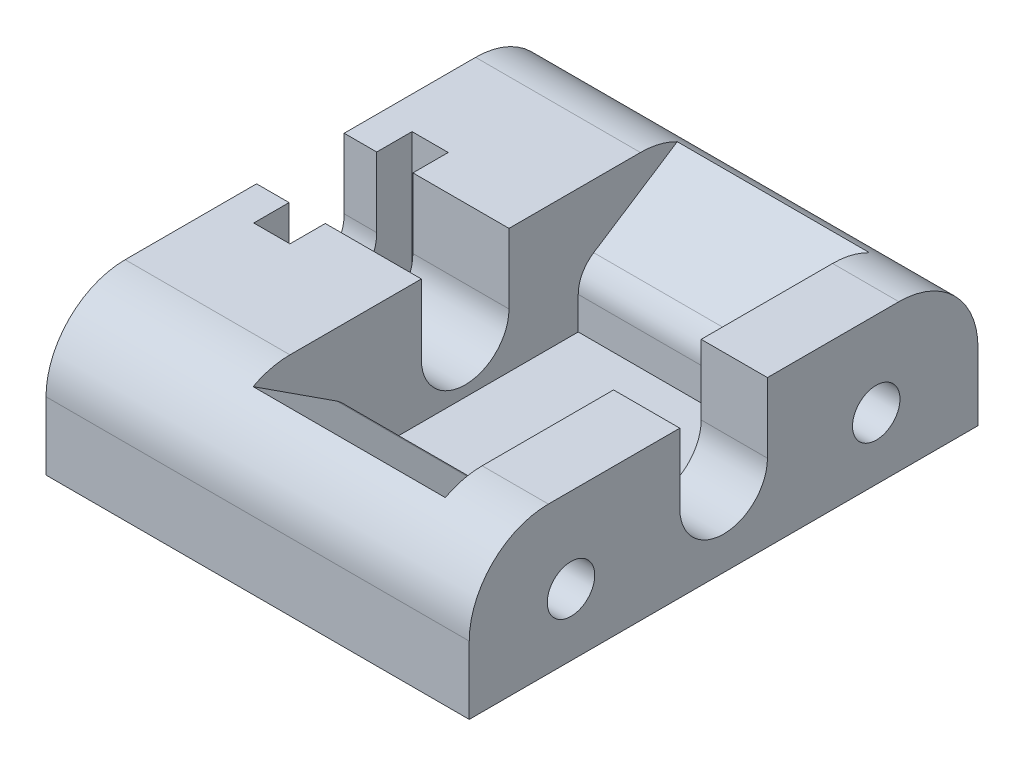
ISO-10303-21;
HEADER;
FILE_DESCRIPTION(('STEP AP214'),'2;1');
FILE_NAME('part.step','',(''),(''),'','','');
FILE_SCHEMA(('AUTOMOTIVE_DESIGN { 1 0 10303 214 1 1 1 1 }'));
ENDSEC;
DATA;
#1=APPLICATION_CONTEXT('core data for automotive mechanical design processes');
#2=APPLICATION_PROTOCOL_DEFINITION('international standard','automotive_design',2000,#1);
#3=PRODUCT_CONTEXT('',#1,'mechanical');
#4=PRODUCT('Part','Part','',(#3));
#5=PRODUCT_RELATED_PRODUCT_CATEGORY('part','',(#4));
#6=PRODUCT_DEFINITION_FORMATION('','',#4);
#7=PRODUCT_DEFINITION_CONTEXT('part definition',#1,'design');
#8=PRODUCT_DEFINITION('design','',#6,#7);
#9=PRODUCT_DEFINITION_SHAPE('','',#8);
#10=(LENGTH_UNIT() NAMED_UNIT(*) SI_UNIT(.MILLI.,.METRE.));
#11=(NAMED_UNIT(*) PLANE_ANGLE_UNIT() SI_UNIT($,.RADIAN.));
#12=(NAMED_UNIT(*) SI_UNIT($,.STERADIAN.) SOLID_ANGLE_UNIT());
#13=UNCERTAINTY_MEASURE_WITH_UNIT(LENGTH_MEASURE(1.E-05),#10,'distance_accuracy_value','');
#14=(GEOMETRIC_REPRESENTATION_CONTEXT(3) GLOBAL_UNCERTAINTY_ASSIGNED_CONTEXT((#13)) GLOBAL_UNIT_ASSIGNED_CONTEXT((#10,
#11,#12)) REPRESENTATION_CONTEXT('',''));
#15=CARTESIAN_POINT('',(0.,0.,0.));
#16=DIRECTION('',(0.,0.,1.));
#17=DIRECTION('',(1.,0.,0.));
#18=AXIS2_PLACEMENT_3D('',#15,#16,#17);
#19=CARTESIAN_POINT('',(0.,42.,-45.));
#20=DIRECTION('',(0.,0.,1.));
#21=DIRECTION('',(1.,0.,0.));
#22=AXIS2_PLACEMENT_3D('',#19,#20,#21);
#23=PLANE('',#22);
#24=DIRECTION('',(1.,0.,0.));
#25=VECTOR('',#24,1.);
#26=CARTESIAN_POINT('',(0.,29.,-45.));
#27=LINE('',#26,#25);
#28=CARTESIAN_POINT('',(129.123144903408,29.,-45.));
#29=VERTEX_POINT('',#28);
#30=CARTESIAN_POINT('',(166.559737407802,29.,-45.));
#31=VERTEX_POINT('',#30);
#32=EDGE_CURVE('E58',#29,#31,#27,.T.);
#33=ORIENTED_EDGE('',*,*,#32,.F.);
#34=DIRECTION('',(0.,1.,0.));
#35=VECTOR('',#34,1.);
#36=CARTESIAN_POINT('',(129.123144903408,42.,-45.));
#37=LINE('',#36,#35);
#38=CARTESIAN_POINT('',(129.123144903408,35.,-45.));
#39=VERTEX_POINT('',#38);
#40=EDGE_CURVE('E598',#29,#39,#37,.T.);
#41=ORIENTED_EDGE('',*,*,#40,.T.);
#42=DIRECTION('',(-1.,0.,0.));
#43=VECTOR('',#42,1.);
#44=CARTESIAN_POINT('',(0.,35.,-45.));
#45=LINE('',#44,#43);
#46=CARTESIAN_POINT('',(166.559737407802,35.,-45.));
#47=VERTEX_POINT('',#46);
#48=EDGE_CURVE('E468',#39,#47,#45,.F.);
#49=ORIENTED_EDGE('',*,*,#48,.T.);
#50=DIRECTION('',(0.,-1.,0.));
#51=VECTOR('',#50,1.);
#52=CARTESIAN_POINT('',(166.559737407802,42.,-45.));
#53=LINE('',#52,#51);
#54=EDGE_CURVE('E65',#47,#31,#53,.T.);
#55=ORIENTED_EDGE('',*,*,#54,.T.);
#56=EDGE_LOOP('',(#33,#41,#49,#55));
#57=FACE_BOUND('',#56,.T.);
#58=ADVANCED_FACE('F43',(#57),#23,.F.);
#59=CARTESIAN_POINT('',(0.,42.,0.));
#60=DIRECTION('',(0.,0.,-1.));
#61=DIRECTION('',(-1.,0.,0.));
#62=AXIS2_PLACEMENT_3D('',#59,#60,#61);
#63=PLANE('',#62);
#64=DIRECTION('',(-1.,0.,0.));
#65=VECTOR('',#64,1.);
#66=CARTESIAN_POINT('',(0.,29.,0.));
#67=LINE('',#66,#65);
#68=CARTESIAN_POINT('',(166.559737407802,29.,0.));
#69=VERTEX_POINT('',#68);
#70=CARTESIAN_POINT('',(129.123144903408,29.,0.));
#71=VERTEX_POINT('',#70);
#72=EDGE_CURVE('E251',#69,#71,#67,.T.);
#73=ORIENTED_EDGE('',*,*,#72,.F.);
#74=DIRECTION('',(0.,1.,0.));
#75=VECTOR('',#74,1.);
#76=CARTESIAN_POINT('',(166.559737407802,42.,0.));
#77=LINE('',#76,#75);
#78=CARTESIAN_POINT('',(166.559737407802,35.,0.));
#79=VERTEX_POINT('',#78);
#80=EDGE_CURVE('E258',#69,#79,#77,.T.);
#81=ORIENTED_EDGE('',*,*,#80,.T.);
#82=DIRECTION('',(1.,0.,0.));
#83=VECTOR('',#82,1.);
#84=CARTESIAN_POINT('',(0.,35.,0.));
#85=LINE('',#84,#83);
#86=CARTESIAN_POINT('',(129.123144903408,35.,0.));
#87=VERTEX_POINT('',#86);
#88=EDGE_CURVE('E472',#79,#87,#85,.F.);
#89=ORIENTED_EDGE('',*,*,#88,.T.);
#90=DIRECTION('',(0.,-1.,0.));
#91=VECTOR('',#90,1.);
#92=CARTESIAN_POINT('',(129.123144903408,42.,0.));
#93=LINE('',#92,#91);
#94=EDGE_CURVE('E260',#87,#71,#93,.T.);
#95=ORIENTED_EDGE('',*,*,#94,.T.);
#96=EDGE_LOOP('',(#73,#81,#89,#95));
#97=FACE_BOUND('',#96,.T.);
#98=ADVANCED_FACE('F256',(#97),#63,.F.);
#99=CARTESIAN_POINT('',(129.123144903408,-5.,-62.8352263072276));
#100=DIRECTION('',(1.,0.,0.));
#101=DIRECTION('',(0.,0.,-1.));
#102=AXIS2_PLACEMENT_3D('',#99,#100,#101);
#103=PLANE('',#102);
#104=CARTESIAN_POINT('',(129.123144903408,34.5,-9.));
#105=DIRECTION('',(1.,0.,0.));
#106=DIRECTION('',(0.,0.,-1.));
#107=AXIS2_PLACEMENT_3D('',#104,#105,#106);
#108=CIRCLE('',#107,2.65);
#109=CARTESIAN_POINT('',(129.123144903408,34.5,-11.65));
#110=VERTEX_POINT('',#109);
#111=EDGE_CURVE('E611',#110,#110,#108,.F.);
#112=ORIENTED_EDGE('',*,*,#111,.F.);
#113=EDGE_LOOP('',(#112));
#114=FACE_BOUND('',#113,.T.);
#115=CARTESIAN_POINT('',(129.123144903408,34.5,-36.));
#116=DIRECTION('',(1.,0.,0.));
#117=DIRECTION('',(0.,0.,-1.));
#118=AXIS2_PLACEMENT_3D('',#115,#116,#117);
#119=CIRCLE('',#118,2.65);
#120=CARTESIAN_POINT('',(129.123144903408,34.5,-38.65));
#121=VERTEX_POINT('',#120);
#122=EDGE_CURVE('E603',#121,#121,#119,.F.);
#123=ORIENTED_EDGE('',*,*,#122,.F.);
#124=EDGE_LOOP('',(#123));
#125=FACE_BOUND('',#124,.T.);
#126=DIRECTION('',(0.,0.,-1.));
#127=VECTOR('',#126,1.);
#128=CARTESIAN_POINT('',(129.123144903408,29.,-62.8352263072276));
#129=LINE('',#128,#127);
#130=EDGE_CURVE('E760',#71,#29,#129,.T.);
#131=ORIENTED_EDGE('',*,*,#130,.F.);
#132=ORIENTED_EDGE('',*,*,#94,.F.);
#133=CARTESIAN_POINT('',(129.123144903408,35.,-7.));
#134=DIRECTION('',(1.,0.,0.));
#135=DIRECTION('',(0.,0.,-1.));
#136=AXIS2_PLACEMENT_3D('',#133,#134,#135);
#137=CIRCLE('',#136,7.);
#138=CARTESIAN_POINT('',(129.123144903408,42.,-7.));
#139=VERTEX_POINT('',#138);
#140=EDGE_CURVE('E599',#87,#139,#137,.F.);
#141=ORIENTED_EDGE('',*,*,#140,.T.);
#142=DIRECTION('',(0.,0.,-1.));
#143=VECTOR('',#142,1.);
#144=CARTESIAN_POINT('',(129.123144903408,42.,-62.8352263072276));
#145=LINE('',#144,#143);
#146=CARTESIAN_POINT('',(129.123144903408,42.,-18.625));
#147=VERTEX_POINT('',#146);
#148=EDGE_CURVE('E765',#139,#147,#145,.T.);
#149=ORIENTED_EDGE('',*,*,#148,.T.);
#150=DIRECTION('',(0.,1.,0.));
#151=VECTOR('',#150,1.);
#152=CARTESIAN_POINT('',(129.123144903408,42.,-18.625));
#153=LINE('',#152,#151);
#154=CARTESIAN_POINT('',(129.123144903408,35.825,-18.625));
#155=VERTEX_POINT('',#154);
#156=EDGE_CURVE('E623',#155,#147,#153,.T.);
#157=ORIENTED_EDGE('',*,*,#156,.F.);
#158=CARTESIAN_POINT('',(129.123144903408,35.825,-22.5));
#159=DIRECTION('',(1.,0.,0.));
#160=DIRECTION('',(0.,0.,-1.));
#161=AXIS2_PLACEMENT_3D('',#158,#159,#160);
#162=CIRCLE('',#161,3.87500000000001);
#163=CARTESIAN_POINT('',(129.123144903408,35.825,-26.375));
#164=VERTEX_POINT('',#163);
#165=EDGE_CURVE('E615',#164,#155,#162,.F.);
#166=ORIENTED_EDGE('',*,*,#165,.F.);
#167=DIRECTION('',(0.,-1.,0.));
#168=VECTOR('',#167,1.);
#169=CARTESIAN_POINT('',(129.123144903408,42.,-26.375));
#170=LINE('',#169,#168);
#171=CARTESIAN_POINT('',(129.123144903408,42.,-26.375));
#172=VERTEX_POINT('',#171);
#173=EDGE_CURVE('E619',#172,#164,#170,.T.);
#174=ORIENTED_EDGE('',*,*,#173,.F.);
#175=CARTESIAN_POINT('',(129.123144903408,42.,-38.));
#176=VERTEX_POINT('',#175);
#177=EDGE_CURVE('E555',#172,#176,#145,.T.);
#178=ORIENTED_EDGE('',*,*,#177,.T.);
#179=CARTESIAN_POINT('',(129.123144903408,35.,-38.));
#180=DIRECTION('',(1.,0.,0.));
#181=DIRECTION('',(0.,0.,-1.));
#182=AXIS2_PLACEMENT_3D('',#179,#180,#181);
#183=CIRCLE('',#182,7.);
#184=EDGE_CURVE('E594',#176,#39,#183,.F.);
#185=ORIENTED_EDGE('',*,*,#184,.T.);
#186=ORIENTED_EDGE('',*,*,#40,.F.);
#187=EDGE_LOOP('',(#131,#132,#141,#149,#157,#166,#174,#178,#185,#186));
#188=FACE_BOUND('',#187,.T.);
#189=ADVANCED_FACE('F637',(#114,#125,#188),#103,.F.);
#190=CARTESIAN_POINT('',(166.559737407802,-5.,-53.6971604203283));
#191=DIRECTION('',(-1.,0.,0.));
#192=DIRECTION('',(0.,0.,1.));
#193=AXIS2_PLACEMENT_3D('',#190,#191,#192);
#194=PLANE('',#193);
#195=CARTESIAN_POINT('',(166.559737407802,34.5,-36.));
#196=DIRECTION('',(-1.,0.,0.));
#197=DIRECTION('',(0.,0.,1.));
#198=AXIS2_PLACEMENT_3D('',#195,#196,#197);
#199=CIRCLE('',#198,2.1);
#200=CARTESIAN_POINT('',(166.559737407802,34.5,-33.9));
#201=VERTEX_POINT('',#200);
#202=EDGE_CURVE('E268',#201,#201,#199,.F.);
#203=ORIENTED_EDGE('',*,*,#202,.F.);
#204=EDGE_LOOP('',(#203));
#205=FACE_BOUND('',#204,.T.);
#206=CARTESIAN_POINT('',(166.559737407802,34.5,-9.));
#207=DIRECTION('',(-1.,0.,0.));
#208=DIRECTION('',(0.,0.,1.));
#209=AXIS2_PLACEMENT_3D('',#206,#207,#208);
#210=CIRCLE('',#209,2.1);
#211=CARTESIAN_POINT('',(166.559737407802,34.5,-6.9));
#212=VERTEX_POINT('',#211);
#213=EDGE_CURVE('E275',#212,#212,#210,.F.);
#214=ORIENTED_EDGE('',*,*,#213,.F.);
#215=EDGE_LOOP('',(#214));
#216=FACE_BOUND('',#215,.T.);
#217=DIRECTION('',(0.,0.,1.));
#218=VECTOR('',#217,1.);
#219=CARTESIAN_POINT('',(166.559737407802,29.,-53.6971604203283));
#220=LINE('',#219,#218);
#221=EDGE_CURVE('E11',#31,#69,#220,.T.);
#222=ORIENTED_EDGE('',*,*,#221,.F.);
#223=ORIENTED_EDGE('',*,*,#54,.F.);
#224=CARTESIAN_POINT('',(166.559737407802,35.,-38.));
#225=DIRECTION('',(-1.,0.,0.));
#226=DIRECTION('',(0.,0.,1.));
#227=AXIS2_PLACEMENT_3D('',#224,#225,#226);
#228=CIRCLE('',#227,7.);
#229=CARTESIAN_POINT('',(166.559737407802,42.,-38.));
#230=VERTEX_POINT('',#229);
#231=EDGE_CURVE('E52',#47,#230,#228,.F.);
#232=ORIENTED_EDGE('',*,*,#231,.T.);
#233=DIRECTION('',(0.,0.,1.));
#234=VECTOR('',#233,1.);
#235=CARTESIAN_POINT('',(166.559737407802,42.,-53.6971604203283));
#236=LINE('',#235,#234);
#237=CARTESIAN_POINT('',(166.559737407802,42.,-26.375));
#238=VERTEX_POINT('',#237);
#239=EDGE_CURVE('E544',#230,#238,#236,.T.);
#240=ORIENTED_EDGE('',*,*,#239,.T.);
#241=DIRECTION('',(0.,1.,0.));
#242=VECTOR('',#241,1.);
#243=CARTESIAN_POINT('',(166.559737407802,42.,-26.375));
#244=LINE('',#243,#242);
#245=CARTESIAN_POINT('',(166.559737407802,35.825,-26.375));
#246=VERTEX_POINT('',#245);
#247=EDGE_CURVE('E282',#246,#238,#244,.T.);
#248=ORIENTED_EDGE('',*,*,#247,.F.);
#249=CARTESIAN_POINT('',(166.559737407802,35.825,-22.5));
#250=DIRECTION('',(-1.,0.,0.));
#251=DIRECTION('',(0.,0.,1.));
#252=AXIS2_PLACEMENT_3D('',#249,#250,#251);
#253=CIRCLE('',#252,3.87500000000001);
#254=CARTESIAN_POINT('',(166.559737407802,35.825,-18.625));
#255=VERTEX_POINT('',#254);
#256=EDGE_CURVE('E272',#255,#246,#253,.F.);
#257=ORIENTED_EDGE('',*,*,#256,.F.);
#258=DIRECTION('',(0.,-1.,0.));
#259=VECTOR('',#258,1.);
#260=CARTESIAN_POINT('',(166.559737407802,42.,-18.625));
#261=LINE('',#260,#259);
#262=CARTESIAN_POINT('',(166.559737407802,42.,-18.625));
#263=VERTEX_POINT('',#262);
#264=EDGE_CURVE('E286',#263,#255,#261,.T.);
#265=ORIENTED_EDGE('',*,*,#264,.F.);
#266=CARTESIAN_POINT('',(166.559737407802,42.,-7.));
#267=VERTEX_POINT('',#266);
#268=EDGE_CURVE('E556',#263,#267,#236,.T.);
#269=ORIENTED_EDGE('',*,*,#268,.T.);
#270=CARTESIAN_POINT('',(166.559737407802,35.,-7.));
#271=DIRECTION('',(-1.,0.,0.));
#272=DIRECTION('',(0.,0.,1.));
#273=AXIS2_PLACEMENT_3D('',#270,#271,#272);
#274=CIRCLE('',#273,7.);
#275=EDGE_CURVE('E265',#267,#79,#274,.F.);
#276=ORIENTED_EDGE('',*,*,#275,.T.);
#277=ORIENTED_EDGE('',*,*,#80,.F.);
#278=EDGE_LOOP('',(#222,#223,#232,#240,#248,#257,#265,#269,#276,#277));
#279=FACE_BOUND('',#278,.T.);
#280=ADVANCED_FACE('F263',(#205,#216,#279),#194,.F.);
#281=CARTESIAN_POINT('',(0.,30.5,0.));
#282=DIRECTION('',(0.,1.,0.));
#283=DIRECTION('',(0.,0.,1.));
#284=AXIS2_PLACEMENT_3D('',#281,#282,#283);
#285=PLANE('',#284);
#286=DIRECTION('',(0.,0.,1.));
#287=VECTOR('',#286,1.);
#288=CARTESIAN_POINT('',(132.,30.5,-29.5));
#289=LINE('',#288,#287);
#290=CARTESIAN_POINT('',(132.,30.5,-29.5));
#291=VERTEX_POINT('',#290);
#292=CARTESIAN_POINT('',(132.,30.5,-15.5));
#293=VERTEX_POINT('',#292);
#294=EDGE_CURVE('E362',#291,#293,#289,.T.);
#295=ORIENTED_EDGE('',*,*,#294,.T.);
#296=DIRECTION('',(1.,0.,0.));
#297=VECTOR('',#296,1.);
#298=CARTESIAN_POINT('',(132.,30.5,-15.5));
#299=LINE('',#298,#297);
#300=CARTESIAN_POINT('',(135.2,30.5,-15.5));
#301=VERTEX_POINT('',#300);
#302=EDGE_CURVE('E366',#293,#301,#299,.T.);
#303=ORIENTED_EDGE('',*,*,#302,.T.);
#304=DIRECTION('',(0.,0.,-1.));
#305=VECTOR('',#304,1.);
#306=CARTESIAN_POINT('',(135.2,30.5,-29.5));
#307=LINE('',#306,#305);
#308=CARTESIAN_POINT('',(135.2,30.5,-29.5));
#309=VERTEX_POINT('',#308);
#310=EDGE_CURVE('E371',#301,#309,#307,.T.);
#311=ORIENTED_EDGE('',*,*,#310,.T.);
#312=DIRECTION('',(-1.,0.,0.));
#313=VECTOR('',#312,1.);
#314=CARTESIAN_POINT('',(132.,30.5,-29.5));
#315=LINE('',#314,#313);
#316=EDGE_CURVE('E375',#309,#291,#315,.T.);
#317=ORIENTED_EDGE('',*,*,#316,.T.);
#318=EDGE_LOOP('',(#295,#303,#311,#317));
#319=FACE_BOUND('',#318,.T.);
#320=ADVANCED_FACE('F636',(#319),#285,.T.);
#321=CARTESIAN_POINT('',(120.2,35.825,-22.5));
#322=DIRECTION('',(1.,0.,0.));
#323=DIRECTION('',(0.,0.,-1.));
#324=AXIS2_PLACEMENT_3D('',#321,#322,#323);
#325=CYLINDRICAL_SURFACE('',#324,3.87500000000001);
#326=DIRECTION('',(1.,0.,0.));
#327=VECTOR('',#326,1.);
#328=CARTESIAN_POINT('',(120.2,35.825,-18.625));
#329=LINE('',#328,#327);
#330=CARTESIAN_POINT('',(135.2,35.825,-18.625));
#331=VERTEX_POINT('',#330);
#332=CARTESIAN_POINT('',(143.7,35.825,-18.625));
#333=VERTEX_POINT('',#332);
#334=EDGE_CURVE('E445',#331,#333,#329,.T.);
#335=ORIENTED_EDGE('',*,*,#334,.T.);
#336=CARTESIAN_POINT('',(143.7,35.825,-22.5));
#337=DIRECTION('',(-1.,0.,0.));
#338=DIRECTION('',(0.,0.,1.));
#339=AXIS2_PLACEMENT_3D('',#336,#337,#338);
#340=CIRCLE('',#339,3.87500000000001);
#341=CARTESIAN_POINT('',(143.7,35.825,-26.375));
#342=VERTEX_POINT('',#341);
#343=EDGE_CURVE('E341',#333,#342,#340,.F.);
#344=ORIENTED_EDGE('',*,*,#343,.T.);
#345=DIRECTION('',(1.,0.,0.));
#346=VECTOR('',#345,1.);
#347=CARTESIAN_POINT('',(120.2,35.825,-26.375));
#348=LINE('',#347,#346);
#349=CARTESIAN_POINT('',(135.2,35.825,-26.375));
#350=VERTEX_POINT('',#349);
#351=EDGE_CURVE('E440',#350,#342,#348,.T.);
#352=ORIENTED_EDGE('',*,*,#351,.F.);
#353=CARTESIAN_POINT('',(135.2,35.825,-22.5));
#354=DIRECTION('',(1.,0.,0.));
#355=DIRECTION('',(0.,0.,-1.));
#356=AXIS2_PLACEMENT_3D('',#353,#354,#355);
#357=CIRCLE('',#356,3.87500000000001);
#358=EDGE_CURVE('E429',#350,#331,#357,.F.);
#359=ORIENTED_EDGE('',*,*,#358,.T.);
#360=EDGE_LOOP('',(#335,#344,#352,#359));
#361=FACE_BOUND('',#360,.T.);
#362=ADVANCED_FACE('F644',(#361),#325,.F.);
#363=CARTESIAN_POINT('',(143.7,33.8770569691095,-35.5));
#364=DIRECTION('',(-1.,0.,0.));
#365=DIRECTION('',(0.,0.,1.));
#366=AXIS2_PLACEMENT_3D('',#363,#364,#365);
#367=CYLINDRICAL_SURFACE('',#366,3.);
#368=CARTESIAN_POINT('',(160.7,33.8770569691095,-35.5));
#369=DIRECTION('',(1.,0.,0.));
#370=DIRECTION('',(0.,0.,-1.));
#371=AXIS2_PLACEMENT_3D('',#368,#369,#370);
#372=CIRCLE('',#371,3.);
#373=CARTESIAN_POINT('',(160.7,36.3930686729457,-33.8660828949549));
#374=VERTEX_POINT('',#373);
#375=CARTESIAN_POINT('',(160.7,33.8770569691095,-32.5));
#376=VERTEX_POINT('',#375);
#377=EDGE_CURVE('E540',#374,#376,#372,.T.);
#378=ORIENTED_EDGE('',*,*,#377,.F.);
#379=DIRECTION('',(-1.,0.,0.));
#380=VECTOR('',#379,1.);
#381=CARTESIAN_POINT('',(160.7,36.3930686729457,-33.8660828949549));
#382=LINE('',#381,#380);
#383=CARTESIAN_POINT('',(143.7,36.3930686729457,-33.8660828949549));
#384=VERTEX_POINT('',#383);
#385=EDGE_CURVE('E528',#384,#374,#382,.F.);
#386=ORIENTED_EDGE('',*,*,#385,.F.);
#387=CARTESIAN_POINT('',(143.7,33.8770569691095,-35.5));
#388=DIRECTION('',(-1.,0.,0.));
#389=DIRECTION('',(0.,0.,1.));
#390=AXIS2_PLACEMENT_3D('',#387,#388,#389);
#391=CIRCLE('',#390,3.);
#392=CARTESIAN_POINT('',(143.7,33.8770569691095,-32.5));
#393=VERTEX_POINT('',#392);
#394=EDGE_CURVE('E537',#393,#384,#391,.T.);
#395=ORIENTED_EDGE('',*,*,#394,.F.);
#396=DIRECTION('',(1.,0.,0.));
#397=VECTOR('',#396,1.);
#398=CARTESIAN_POINT('',(143.7,33.8770569691095,-32.5));
#399=LINE('',#398,#397);
#400=EDGE_CURVE('E524',#376,#393,#399,.F.);
#401=ORIENTED_EDGE('',*,*,#400,.F.);
#402=EDGE_LOOP('',(#378,#386,#395,#401));
#403=FACE_BOUND('',#402,.T.);
#404=ADVANCED_FACE('F45',(#403),#367,.T.);
#405=CARTESIAN_POINT('',(143.7,31.,-32.5));
#406=DIRECTION('',(0.,0.,-1.));
#407=DIRECTION('',(-1.,0.,0.));
#408=AXIS2_PLACEMENT_3D('',#405,#406,#407);
#409=PLANE('',#408);
#410=DIRECTION('',(0.,1.,0.));
#411=VECTOR('',#410,1.);
#412=CARTESIAN_POINT('',(160.7,31.,-32.5));
#413=LINE('',#412,#411);
#414=CARTESIAN_POINT('',(160.7,31.,-32.5));
#415=VERTEX_POINT('',#414);
#416=EDGE_CURVE('E319',#415,#376,#413,.T.);
#417=ORIENTED_EDGE('',*,*,#416,.T.);
#418=ORIENTED_EDGE('',*,*,#400,.T.);
#419=DIRECTION('',(0.,1.,0.));
#420=VECTOR('',#419,1.);
#421=CARTESIAN_POINT('',(143.7,31.,-32.5));
#422=LINE('',#421,#420);
#423=CARTESIAN_POINT('',(143.7,31.,-32.5));
#424=VERTEX_POINT('',#423);
#425=EDGE_CURVE('E314',#424,#393,#422,.T.);
#426=ORIENTED_EDGE('',*,*,#425,.F.);
#427=DIRECTION('',(-1.,0.,0.));
#428=VECTOR('',#427,1.);
#429=CARTESIAN_POINT('',(143.7,31.,-32.5));
#430=LINE('',#429,#428);
#431=EDGE_CURVE('E304',#415,#424,#430,.T.);
#432=ORIENTED_EDGE('',*,*,#431,.F.);
#433=EDGE_LOOP('',(#417,#418,#426,#432));
#434=FACE_BOUND('',#433,.T.);
#435=ADVANCED_FACE('F715',(#434),#409,.F.);
#436=CARTESIAN_POINT('',(0.,31.,0.));
#437=DIRECTION('',(0.,1.,0.));
#438=DIRECTION('',(0.,0.,1.));
#439=AXIS2_PLACEMENT_3D('',#436,#437,#438);
#440=PLANE('',#439);
#441=DIRECTION('',(0.,0.,1.));
#442=VECTOR('',#441,1.);
#443=CARTESIAN_POINT('',(143.7,31.,-32.5));
#444=LINE('',#443,#442);
#445=CARTESIAN_POINT('',(143.7,31.,-12.5));
#446=VERTEX_POINT('',#445);
#447=EDGE_CURVE('E291',#424,#446,#444,.T.);
#448=ORIENTED_EDGE('',*,*,#447,.T.);
#449=DIRECTION('',(1.,0.,0.));
#450=VECTOR('',#449,1.);
#451=CARTESIAN_POINT('',(143.7,31.,-12.5));
#452=LINE('',#451,#450);
#453=CARTESIAN_POINT('',(160.7,31.,-12.5));
#454=VERTEX_POINT('',#453);
#455=EDGE_CURVE('E295',#446,#454,#452,.T.);
#456=ORIENTED_EDGE('',*,*,#455,.T.);
#457=DIRECTION('',(0.,0.,-1.));
#458=VECTOR('',#457,1.);
#459=CARTESIAN_POINT('',(160.7,31.,-32.5));
#460=LINE('',#459,#458);
#461=EDGE_CURVE('E300',#454,#415,#460,.T.);
#462=ORIENTED_EDGE('',*,*,#461,.T.);
#463=ORIENTED_EDGE('',*,*,#431,.T.);
#464=EDGE_LOOP('',(#448,#456,#462,#463));
#465=FACE_BOUND('',#464,.T.);
#466=ADVANCED_FACE('F699',(#465),#440,.T.);
#467=CARTESIAN_POINT('',(143.7,31.,-12.5));
#468=DIRECTION('',(0.,0.,1.));
#469=DIRECTION('',(1.,0.,0.));
#470=AXIS2_PLACEMENT_3D('',#467,#468,#469);
#471=PLANE('',#470);
#472=DIRECTION('',(0.,1.,0.));
#473=VECTOR('',#472,1.);
#474=CARTESIAN_POINT('',(143.7,31.,-12.5));
#475=LINE('',#474,#473);
#476=CARTESIAN_POINT('',(143.7,33.8770569691095,-12.5));
#477=VERTEX_POINT('',#476);
#478=EDGE_CURVE('E308',#446,#477,#475,.T.);
#479=ORIENTED_EDGE('',*,*,#478,.T.);
#480=DIRECTION('',(-1.,0.,0.));
#481=VECTOR('',#480,1.);
#482=CARTESIAN_POINT('',(160.7,33.8770569691095,-12.5));
#483=LINE('',#482,#481);
#484=CARTESIAN_POINT('',(160.7,33.8770569691095,-12.5));
#485=VERTEX_POINT('',#484);
#486=EDGE_CURVE('E517',#477,#485,#483,.F.);
#487=ORIENTED_EDGE('',*,*,#486,.T.);
#488=DIRECTION('',(0.,1.,0.));
#489=VECTOR('',#488,1.);
#490=CARTESIAN_POINT('',(160.7,31.,-12.5));
#491=LINE('',#490,#489);
#492=EDGE_CURVE('E323',#454,#485,#491,.T.);
#493=ORIENTED_EDGE('',*,*,#492,.F.);
#494=ORIENTED_EDGE('',*,*,#455,.F.);
#495=EDGE_LOOP('',(#479,#487,#493,#494));
#496=FACE_BOUND('',#495,.T.);
#497=ADVANCED_FACE('F689',(#496),#471,.F.);
#498=CARTESIAN_POINT('',(143.7,33.8770569691095,-9.5));
#499=DIRECTION('',(1.,0.,0.));
#500=DIRECTION('',(0.,0.,-1.));
#501=AXIS2_PLACEMENT_3D('',#498,#499,#500);
#502=CYLINDRICAL_SURFACE('',#501,3.);
#503=CARTESIAN_POINT('',(143.7,33.8770569691095,-9.5));
#504=DIRECTION('',(-1.,0.,0.));
#505=DIRECTION('',(0.,0.,1.));
#506=AXIS2_PLACEMENT_3D('',#503,#504,#505);
#507=CIRCLE('',#506,3.);
#508=CARTESIAN_POINT('',(143.7,36.3930686729457,-11.1339171050451));
#509=VERTEX_POINT('',#508);
#510=EDGE_CURVE('E534',#509,#477,#507,.T.);
#511=ORIENTED_EDGE('',*,*,#510,.F.);
#512=DIRECTION('',(1.,0.,0.));
#513=VECTOR('',#512,1.);
#514=CARTESIAN_POINT('',(143.7,36.3930686729457,-11.1339171050451));
#515=LINE('',#514,#513);
#516=CARTESIAN_POINT('',(160.7,36.3930686729457,-11.1339171050451));
#517=VERTEX_POINT('',#516);
#518=EDGE_CURVE('E521',#517,#509,#515,.F.);
#519=ORIENTED_EDGE('',*,*,#518,.F.);
#520=CARTESIAN_POINT('',(160.7,33.8770569691095,-9.5));
#521=DIRECTION('',(1.,0.,0.));
#522=DIRECTION('',(0.,0.,-1.));
#523=AXIS2_PLACEMENT_3D('',#520,#521,#522);
#524=CIRCLE('',#523,3.);
#525=EDGE_CURVE('E531',#485,#517,#524,.T.);
#526=ORIENTED_EDGE('',*,*,#525,.F.);
#527=ORIENTED_EDGE('',*,*,#486,.F.);
#528=EDGE_LOOP('',(#511,#519,#526,#527));
#529=FACE_BOUND('',#528,.T.);
#530=ADVANCED_FACE('F686',(#529),#502,.T.);
#531=CARTESIAN_POINT('',(120.2,42.,-26.375));
#532=DIRECTION('',(0.,0.,-1.));
#533=DIRECTION('',(0.,1.,0.));
#534=AXIS2_PLACEMENT_3D('',#531,#532,#533);
#535=PLANE('',#534);
#536=ORIENTED_EDGE('',*,*,#351,.T.);
#537=DIRECTION('',(0.,1.,0.));
#538=VECTOR('',#537,1.);
#539=CARTESIAN_POINT('',(143.7,42.,-26.375));
#540=LINE('',#539,#538);
#541=CARTESIAN_POINT('',(143.7,42.,-26.375));
#542=VERTEX_POINT('',#541);
#543=EDGE_CURVE('E345',#342,#542,#540,.T.);
#544=ORIENTED_EDGE('',*,*,#543,.T.);
#545=DIRECTION('',(1.,0.,0.));
#546=VECTOR('',#545,1.);
#547=CARTESIAN_POINT('',(120.2,42.,-26.375));
#548=LINE('',#547,#546);
#549=CARTESIAN_POINT('',(135.2,42.,-26.375));
#550=VERTEX_POINT('',#549);
#551=EDGE_CURVE('E435',#550,#542,#548,.T.);
#552=ORIENTED_EDGE('',*,*,#551,.F.);
#553=DIRECTION('',(0.,-1.,0.));
#554=VECTOR('',#553,1.);
#555=CARTESIAN_POINT('',(135.2,42.,-26.375));
#556=LINE('',#555,#554);
#557=EDGE_CURVE('E399',#550,#350,#556,.T.);
#558=ORIENTED_EDGE('',*,*,#557,.T.);
#559=EDGE_LOOP('',(#536,#544,#552,#558));
#560=FACE_BOUND('',#559,.T.);
#561=ADVANCED_FACE('F688',(#560),#535,.F.);
#562=CARTESIAN_POINT('',(132.,30.5,-29.5));
#563=DIRECTION('',(0.,0.,-1.));
#564=DIRECTION('',(-1.,0.,0.));
#565=AXIS2_PLACEMENT_3D('',#562,#563,#564);
#566=PLANE('',#565);
#567=DIRECTION('',(-1.,0.,0.));
#568=VECTOR('',#567,1.);
#569=CARTESIAN_POINT('',(132.,42.,-29.5));
#570=LINE('',#569,#568);
#571=CARTESIAN_POINT('',(135.2,42.,-29.5));
#572=VERTEX_POINT('',#571);
#573=CARTESIAN_POINT('',(132.,42.,-29.5));
#574=VERTEX_POINT('',#573);
#575=EDGE_CURVE('E367',#572,#574,#570,.T.);
#576=ORIENTED_EDGE('',*,*,#575,.T.);
#577=DIRECTION('',(0.,1.,0.));
#578=VECTOR('',#577,1.);
#579=CARTESIAN_POINT('',(132.,30.5,-29.5));
#580=LINE('',#579,#578);
#581=EDGE_CURVE('E396',#291,#574,#580,.T.);
#582=ORIENTED_EDGE('',*,*,#581,.F.);
#583=ORIENTED_EDGE('',*,*,#316,.F.);
#584=DIRECTION('',(0.,1.,0.));
#585=VECTOR('',#584,1.);
#586=CARTESIAN_POINT('',(135.2,30.5,-29.5));
#587=LINE('',#586,#585);
#588=EDGE_CURVE('E400',#309,#572,#587,.T.);
#589=ORIENTED_EDGE('',*,*,#588,.T.);
#590=EDGE_LOOP('',(#576,#582,#583,#589));
#591=FACE_BOUND('',#590,.T.);
#592=ADVANCED_FACE('F678',(#591),#566,.F.);
#593=CARTESIAN_POINT('',(143.7,35.5059240680248,-12.5));
#594=DIRECTION('',(0.,-0.83867056794542,0.544639035015033));
#595=DIRECTION('',(1.,0.,0.));
#596=AXIS2_PLACEMENT_3D('',#593,#594,#595);
#597=PLANE('',#596);
#598=DIRECTION('',(0.,-0.544639035015033,-0.83867056794542));
#599=VECTOR('',#598,1.);
#600=CARTESIAN_POINT('',(160.7,25.0338696722777,-28.6255496631711));
#601=LINE('',#600,#599);
#602=CARTESIAN_POINT('',(160.7,41.1946304082486,-3.74016041725954));
#603=VERTEX_POINT('',#602);
#604=EDGE_CURVE('E503',#517,#603,#601,.F.);
#605=ORIENTED_EDGE('',*,*,#604,.F.);
#606=ORIENTED_EDGE('',*,*,#518,.T.);
#607=DIRECTION('',(0.,0.544639035015033,0.83867056794542));
#608=VECTOR('',#607,1.);
#609=CARTESIAN_POINT('',(143.7,25.0338696722777,-28.6255496631711));
#610=LINE('',#609,#608);
#611=CARTESIAN_POINT('',(143.7,41.1946304082486,-3.74016041725953));
#612=VERTEX_POINT('',#611);
#613=EDGE_CURVE('E506',#612,#509,#610,.F.);
#614=ORIENTED_EDGE('',*,*,#613,.F.);
#615=DIRECTION('',(1.,0.,0.));
#616=VECTOR('',#615,1.);
#617=CARTESIAN_POINT('',(152.2,41.1946304082486,-3.74016041725953));
#618=LINE('',#617,#616);
#619=EDGE_CURVE('E479',#603,#612,#618,.F.);
#620=ORIENTED_EDGE('',*,*,#619,.F.);
#621=EDGE_LOOP('',(#605,#606,#614,#620));
#622=FACE_BOUND('',#621,.T.);
#623=ADVANCED_FACE('F671',(#622),#597,.F.);
#624=CARTESIAN_POINT('',(132.,30.5,-29.5));
#625=DIRECTION('',(-1.,0.,0.));
#626=DIRECTION('',(0.,0.,1.));
#627=AXIS2_PLACEMENT_3D('',#624,#625,#626);
#628=PLANE('',#627);
#629=DIRECTION('',(0.,0.,1.));
#630=VECTOR('',#629,1.);
#631=CARTESIAN_POINT('',(132.,42.,-29.5));
#632=LINE('',#631,#630);
#633=CARTESIAN_POINT('',(132.,42.,-18.625));
#634=VERTEX_POINT('',#633);
#635=CARTESIAN_POINT('',(132.,42.,-15.5));
#636=VERTEX_POINT('',#635);
#637=EDGE_CURVE('E385',#634,#636,#632,.T.);
#638=ORIENTED_EDGE('',*,*,#637,.T.);
#639=DIRECTION('',(0.,1.,0.));
#640=VECTOR('',#639,1.);
#641=CARTESIAN_POINT('',(132.,30.5,-15.5));
#642=LINE('',#641,#640);
#643=EDGE_CURVE('E379',#293,#636,#642,.T.);
#644=ORIENTED_EDGE('',*,*,#643,.F.);
#645=ORIENTED_EDGE('',*,*,#294,.F.);
#646=ORIENTED_EDGE('',*,*,#581,.T.);
#647=CARTESIAN_POINT('',(132.,42.,-26.375));
#648=VERTEX_POINT('',#647);
#649=EDGE_CURVE('E380',#574,#648,#632,.T.);
#650=ORIENTED_EDGE('',*,*,#649,.T.);
#651=DIRECTION('',(0.,1.,0.));
#652=VECTOR('',#651,1.);
#653=CARTESIAN_POINT('',(132.,42.,-26.375));
#654=LINE('',#653,#652);
#655=CARTESIAN_POINT('',(132.,35.825,-26.375));
#656=VERTEX_POINT('',#655);
#657=EDGE_CURVE('E417',#656,#648,#654,.T.);
#658=ORIENTED_EDGE('',*,*,#657,.F.);
#659=CARTESIAN_POINT('',(132.,35.825,-22.5));
#660=DIRECTION('',(-1.,0.,0.));
#661=DIRECTION('',(0.,0.,1.));
#662=AXIS2_PLACEMENT_3D('',#659,#660,#661);
#663=CIRCLE('',#662,3.87500000000001);
#664=CARTESIAN_POINT('',(132.,35.825,-18.625));
#665=VERTEX_POINT('',#664);
#666=EDGE_CURVE('E449',#665,#656,#663,.F.);
#667=ORIENTED_EDGE('',*,*,#666,.F.);
#668=DIRECTION('',(0.,-1.,0.));
#669=VECTOR('',#668,1.);
#670=CARTESIAN_POINT('',(132.,42.,-18.625));
#671=LINE('',#670,#669);
#672=EDGE_CURVE('E421',#634,#665,#671,.T.);
#673=ORIENTED_EDGE('',*,*,#672,.F.);
#674=EDGE_LOOP('',(#638,#644,#645,#646,#650,#658,#667,#673));
#675=FACE_BOUND('',#674,.T.);
#676=ADVANCED_FACE('F677',(#675),#628,.F.);
#677=CARTESIAN_POINT('',(132.,30.5,-15.5));
#678=DIRECTION('',(0.,0.,1.));
#679=DIRECTION('',(1.,0.,0.));
#680=AXIS2_PLACEMENT_3D('',#677,#678,#679);
#681=PLANE('',#680);
#682=DIRECTION('',(1.,0.,0.));
#683=VECTOR('',#682,1.);
#684=CARTESIAN_POINT('',(132.,42.,-15.5));
#685=LINE('',#684,#683);
#686=CARTESIAN_POINT('',(135.2,42.,-15.5));
#687=VERTEX_POINT('',#686);
#688=EDGE_CURVE('E384',#636,#687,#685,.T.);
#689=ORIENTED_EDGE('',*,*,#688,.T.);
#690=DIRECTION('',(0.,1.,0.));
#691=VECTOR('',#690,1.);
#692=CARTESIAN_POINT('',(135.2,30.5,-15.5));
#693=LINE('',#692,#691);
#694=EDGE_CURVE('E404',#301,#687,#693,.T.);
#695=ORIENTED_EDGE('',*,*,#694,.F.);
#696=ORIENTED_EDGE('',*,*,#302,.F.);
#697=ORIENTED_EDGE('',*,*,#643,.T.);
#698=EDGE_LOOP('',(#689,#695,#696,#697));
#699=FACE_BOUND('',#698,.T.);
#700=ADVANCED_FACE('F734',(#699),#681,.F.);
#701=CARTESIAN_POINT('',(135.2,30.5,-29.5));
#702=DIRECTION('',(1.,0.,0.));
#703=DIRECTION('',(0.,0.,-1.));
#704=AXIS2_PLACEMENT_3D('',#701,#702,#703);
#705=PLANE('',#704);
#706=ORIENTED_EDGE('',*,*,#358,.F.);
#707=ORIENTED_EDGE('',*,*,#557,.F.);
#708=DIRECTION('',(0.,0.,-1.));
#709=VECTOR('',#708,1.);
#710=CARTESIAN_POINT('',(135.2,42.,-29.5));
#711=LINE('',#710,#709);
#712=EDGE_CURVE('E389',#550,#572,#711,.T.);
#713=ORIENTED_EDGE('',*,*,#712,.T.);
#714=ORIENTED_EDGE('',*,*,#588,.F.);
#715=ORIENTED_EDGE('',*,*,#310,.F.);
#716=ORIENTED_EDGE('',*,*,#694,.T.);
#717=CARTESIAN_POINT('',(135.2,42.,-18.625));
#718=VERTEX_POINT('',#717);
#719=EDGE_CURVE('E390',#687,#718,#711,.T.);
#720=ORIENTED_EDGE('',*,*,#719,.T.);
#721=DIRECTION('',(0.,1.,0.));
#722=VECTOR('',#721,1.);
#723=CARTESIAN_POINT('',(135.2,42.,-18.625));
#724=LINE('',#723,#722);
#725=EDGE_CURVE('E413',#331,#718,#724,.T.);
#726=ORIENTED_EDGE('',*,*,#725,.F.);
#727=EDGE_LOOP('',(#706,#707,#713,#714,#715,#716,#720,#726));
#728=FACE_BOUND('',#727,.T.);
#729=ADVANCED_FACE('F725',(#728),#705,.F.);
#730=CARTESIAN_POINT('',(120.2,42.,-18.625));
#731=DIRECTION('',(0.,0.,1.));
#732=DIRECTION('',(1.,0.,0.));
#733=AXIS2_PLACEMENT_3D('',#730,#731,#732);
#734=PLANE('',#733);
#735=DIRECTION('',(1.,0.,0.));
#736=VECTOR('',#735,1.);
#737=CARTESIAN_POINT('',(120.2,42.,-18.625));
#738=LINE('',#737,#736);
#739=CARTESIAN_POINT('',(143.7,42.,-18.625));
#740=VERTEX_POINT('',#739);
#741=EDGE_CURVE('E430',#718,#740,#738,.T.);
#742=ORIENTED_EDGE('',*,*,#741,.T.);
#743=DIRECTION('',(0.,-1.,0.));
#744=VECTOR('',#743,1.);
#745=CARTESIAN_POINT('',(143.7,42.,-18.625));
#746=LINE('',#745,#744);
#747=EDGE_CURVE('E349',#740,#333,#746,.T.);
#748=ORIENTED_EDGE('',*,*,#747,.T.);
#749=ORIENTED_EDGE('',*,*,#334,.F.);
#750=ORIENTED_EDGE('',*,*,#725,.T.);
#751=EDGE_LOOP('',(#742,#748,#749,#750));
#752=FACE_BOUND('',#751,.T.);
#753=ADVANCED_FACE('F740',(#752),#734,.F.);
#754=CARTESIAN_POINT('',(160.7,31.,-32.5));
#755=DIRECTION('',(1.,0.,0.));
#756=DIRECTION('',(0.,0.,-1.));
#757=AXIS2_PLACEMENT_3D('',#754,#755,#756);
#758=PLANE('',#757);
#759=CARTESIAN_POINT('',(160.7,35.825,-22.5));
#760=DIRECTION('',(1.,0.,0.));
#761=DIRECTION('',(0.,0.,-1.));
#762=AXIS2_PLACEMENT_3D('',#759,#760,#761);
#763=CIRCLE('',#762,3.87500000000001);
#764=CARTESIAN_POINT('',(160.7,35.825,-26.375));
#765=VERTEX_POINT('',#764);
#766=CARTESIAN_POINT('',(160.7,35.825,-18.625));
#767=VERTEX_POINT('',#766);
#768=EDGE_CURVE('E318',#765,#767,#763,.F.);
#769=ORIENTED_EDGE('',*,*,#768,.F.);
#770=DIRECTION('',(0.,-1.,0.));
#771=VECTOR('',#770,1.);
#772=CARTESIAN_POINT('',(160.7,42.,-26.375));
#773=LINE('',#772,#771);
#774=CARTESIAN_POINT('',(160.7,42.,-26.375));
#775=VERTEX_POINT('',#774);
#776=EDGE_CURVE('E333',#775,#765,#773,.T.);
#777=ORIENTED_EDGE('',*,*,#776,.F.);
#778=DIRECTION('',(0.,0.,-1.));
#779=VECTOR('',#778,1.);
#780=CARTESIAN_POINT('',(160.7,42.,-32.5));
#781=LINE('',#780,#779);
#782=CARTESIAN_POINT('',(160.7,42.,-38.));
#783=VERTEX_POINT('',#782);
#784=EDGE_CURVE('E311',#775,#783,#781,.T.);
#785=ORIENTED_EDGE('',*,*,#784,.T.);
#786=CARTESIAN_POINT('',(160.7,35.,-38.));
#787=DIRECTION('',(1.,0.,0.));
#788=DIRECTION('',(0.,0.,-1.));
#789=AXIS2_PLACEMENT_3D('',#786,#787,#788);
#790=CIRCLE('',#789,7.);
#791=CARTESIAN_POINT('',(160.7,41.1946304082486,-41.2598395827405));
#792=VERTEX_POINT('',#791);
#793=EDGE_CURVE('E495',#792,#783,#790,.T.);
#794=ORIENTED_EDGE('',*,*,#793,.F.);
#795=DIRECTION('',(0.,0.544639035015032,-0.838670567945421));
#796=VECTOR('',#795,1.);
#797=CARTESIAN_POINT('',(160.7,34.1693242487038,-30.4418167675867));
#798=LINE('',#797,#796);
#799=EDGE_CURVE('E513',#792,#374,#798,.F.);
#800=ORIENTED_EDGE('',*,*,#799,.T.);
#801=ORIENTED_EDGE('',*,*,#377,.T.);
#802=ORIENTED_EDGE('',*,*,#416,.F.);
#803=ORIENTED_EDGE('',*,*,#461,.F.);
#804=ORIENTED_EDGE('',*,*,#492,.T.);
#805=ORIENTED_EDGE('',*,*,#525,.T.);
#806=ORIENTED_EDGE('',*,*,#604,.T.);
#807=CARTESIAN_POINT('',(160.7,35.,-7.));
#808=DIRECTION('',(1.,0.,0.));
#809=DIRECTION('',(0.,0.,-1.));
#810=AXIS2_PLACEMENT_3D('',#807,#808,#809);
#811=CIRCLE('',#810,7.);
#812=CARTESIAN_POINT('',(160.7,42.,-7.));
#813=VERTEX_POINT('',#812);
#814=EDGE_CURVE('E487',#813,#603,#811,.T.);
#815=ORIENTED_EDGE('',*,*,#814,.F.);
#816=CARTESIAN_POINT('',(160.7,42.,-18.625));
#817=VERTEX_POINT('',#816);
#818=EDGE_CURVE('E296',#813,#817,#781,.T.);
#819=ORIENTED_EDGE('',*,*,#818,.T.);
#820=DIRECTION('',(0.,1.,0.));
#821=VECTOR('',#820,1.);
#822=CARTESIAN_POINT('',(160.7,42.,-18.625));
#823=LINE('',#822,#821);
#824=EDGE_CURVE('E337',#767,#817,#823,.T.);
#825=ORIENTED_EDGE('',*,*,#824,.F.);
#826=EDGE_LOOP('',(#769,#777,#785,#794,#800,#801,#802,#803,#804,#805,#806,#815,#819,#825));
#827=FACE_BOUND('',#826,.T.);
#828=ADVANCED_FACE('F563',(#827),#758,.F.);
#829=CARTESIAN_POINT('',(143.7,35.5059240680248,-32.5));
#830=DIRECTION('',(0.,-0.838670567945421,-0.544639035015032));
#831=DIRECTION('',(-1.,0.,0.));
#832=AXIS2_PLACEMENT_3D('',#829,#830,#831);
#833=PLANE('',#832);
#834=DIRECTION('',(0.,-0.544639035015032,0.838670567945421));
#835=VECTOR('',#834,1.);
#836=CARTESIAN_POINT('',(143.7,34.1693242487038,-30.4418167675867));
#837=LINE('',#836,#835);
#838=CARTESIAN_POINT('',(143.7,41.1946304082486,-41.2598395827405));
#839=VERTEX_POINT('',#838);
#840=EDGE_CURVE('E510',#384,#839,#837,.F.);
#841=ORIENTED_EDGE('',*,*,#840,.F.);
#842=ORIENTED_EDGE('',*,*,#385,.T.);
#843=ORIENTED_EDGE('',*,*,#799,.F.);
#844=DIRECTION('',(-1.,0.,0.));
#845=VECTOR('',#844,1.);
#846=CARTESIAN_POINT('',(152.2,41.1946304082486,-41.2598395827405));
#847=LINE('',#846,#845);
#848=EDGE_CURVE('E491',#839,#792,#847,.F.);
#849=ORIENTED_EDGE('',*,*,#848,.F.);
#850=EDGE_LOOP('',(#841,#842,#843,#849));
#851=FACE_BOUND('',#850,.T.);
#852=ADVANCED_FACE('F680',(#851),#833,.F.);
#853=CARTESIAN_POINT('',(143.7,31.,-32.5));
#854=DIRECTION('',(-1.,0.,0.));
#855=DIRECTION('',(0.,0.,1.));
#856=AXIS2_PLACEMENT_3D('',#853,#854,#855);
#857=PLANE('',#856);
#858=DIRECTION('',(0.,0.,-1.));
#859=VECTOR('',#858,1.);
#860=CARTESIAN_POINT('',(143.7,42.,0.));
#861=LINE('',#860,#859);
#862=CARTESIAN_POINT('',(143.7,42.,-7.));
#863=VERTEX_POINT('',#862);
#864=EDGE_CURVE('E475',#863,#740,#861,.T.);
#865=ORIENTED_EDGE('',*,*,#864,.F.);
#866=CARTESIAN_POINT('',(143.7,35.,-7.));
#867=DIRECTION('',(-1.,0.,0.));
#868=DIRECTION('',(0.,0.,1.));
#869=AXIS2_PLACEMENT_3D('',#866,#867,#868);
#870=CIRCLE('',#869,7.);
#871=EDGE_CURVE('E483',#612,#863,#870,.T.);
#872=ORIENTED_EDGE('',*,*,#871,.F.);
#873=ORIENTED_EDGE('',*,*,#613,.T.);
#874=ORIENTED_EDGE('',*,*,#510,.T.);
#875=ORIENTED_EDGE('',*,*,#478,.F.);
#876=ORIENTED_EDGE('',*,*,#447,.F.);
#877=ORIENTED_EDGE('',*,*,#425,.T.);
#878=ORIENTED_EDGE('',*,*,#394,.T.);
#879=ORIENTED_EDGE('',*,*,#840,.T.);
#880=CARTESIAN_POINT('',(143.7,35.,-38.));
#881=DIRECTION('',(-1.,0.,0.));
#882=DIRECTION('',(0.,0.,1.));
#883=AXIS2_PLACEMENT_3D('',#880,#881,#882);
#884=CIRCLE('',#883,7.);
#885=CARTESIAN_POINT('',(143.7,42.,-38.));
#886=VERTEX_POINT('',#885);
#887=EDGE_CURVE('E499',#886,#839,#884,.T.);
#888=ORIENTED_EDGE('',*,*,#887,.F.);
#889=DIRECTION('',(0.,0.,1.));
#890=VECTOR('',#889,1.);
#891=CARTESIAN_POINT('',(143.7,42.,-32.5));
#892=LINE('',#891,#890);
#893=EDGE_CURVE('E290',#886,#542,#892,.T.);
#894=ORIENTED_EDGE('',*,*,#893,.T.);
#895=ORIENTED_EDGE('',*,*,#543,.F.);
#896=ORIENTED_EDGE('',*,*,#343,.F.);
#897=ORIENTED_EDGE('',*,*,#747,.F.);
#898=EDGE_LOOP('',(#865,#872,#873,#874,#875,#876,#877,#878,#879,#888,#894,#895,#896,#897));
#899=FACE_BOUND('',#898,.T.);
#900=ADVANCED_FACE('F684',(#899),#857,.F.);
#901=EDGE_CURVE('E425',#767,#255,#329,.T.);
#902=ORIENTED_EDGE('',*,*,#901,.T.);
#903=ORIENTED_EDGE('',*,*,#256,.T.);
#904=EDGE_CURVE('E441',#765,#246,#348,.T.);
#905=ORIENTED_EDGE('',*,*,#904,.F.);
#906=ORIENTED_EDGE('',*,*,#768,.T.);
#907=EDGE_LOOP('',(#902,#903,#905,#906));
#908=FACE_BOUND('',#907,.T.);
#909=ADVANCED_FACE('F757',(#908),#325,.F.);
#910=ORIENTED_EDGE('',*,*,#904,.T.);
#911=ORIENTED_EDGE('',*,*,#247,.T.);
#912=EDGE_CURVE('E436',#775,#238,#548,.T.);
#913=ORIENTED_EDGE('',*,*,#912,.F.);
#914=ORIENTED_EDGE('',*,*,#776,.T.);
#915=EDGE_LOOP('',(#910,#911,#913,#914));
#916=FACE_BOUND('',#915,.T.);
#917=ADVANCED_FACE('F697',(#916),#535,.F.);
#918=EDGE_CURVE('E431',#817,#263,#738,.T.);
#919=ORIENTED_EDGE('',*,*,#918,.T.);
#920=ORIENTED_EDGE('',*,*,#264,.T.);
#921=ORIENTED_EDGE('',*,*,#901,.F.);
#922=ORIENTED_EDGE('',*,*,#824,.T.);
#923=EDGE_LOOP('',(#919,#920,#921,#922));
#924=FACE_BOUND('',#923,.T.);
#925=ADVANCED_FACE('F753',(#924),#734,.F.);
#926=CARTESIAN_POINT('',(0.,42.,0.));
#927=DIRECTION('',(0.,-1.,0.));
#928=DIRECTION('',(0.,0.,-1.));
#929=AXIS2_PLACEMENT_3D('',#926,#927,#928);
#930=PLANE('',#929);
#931=EDGE_CURVE('E426',#147,#634,#738,.T.);
#932=ORIENTED_EDGE('',*,*,#931,.F.);
#933=ORIENTED_EDGE('',*,*,#148,.F.);
#934=DIRECTION('',(1.,0.,0.));
#935=VECTOR('',#934,1.);
#936=CARTESIAN_POINT('',(0.,42.,-7.));
#937=LINE('',#936,#935);
#938=EDGE_CURVE('E461',#139,#863,#937,.T.);
#939=ORIENTED_EDGE('',*,*,#938,.T.);
#940=ORIENTED_EDGE('',*,*,#864,.T.);
#941=ORIENTED_EDGE('',*,*,#741,.F.);
#942=ORIENTED_EDGE('',*,*,#719,.F.);
#943=ORIENTED_EDGE('',*,*,#688,.F.);
#944=ORIENTED_EDGE('',*,*,#637,.F.);
#945=EDGE_LOOP('',(#932,#933,#939,#940,#941,#942,#943,#944));
#946=FACE_BOUND('',#945,.T.);
#947=ADVANCED_FACE('F659',(#946),#930,.F.);
#948=EDGE_CURVE('E437',#164,#656,#348,.T.);
#949=ORIENTED_EDGE('',*,*,#948,.F.);
#950=ORIENTED_EDGE('',*,*,#165,.T.);
#951=EDGE_CURVE('E442',#155,#665,#329,.T.);
#952=ORIENTED_EDGE('',*,*,#951,.T.);
#953=ORIENTED_EDGE('',*,*,#666,.T.);
#954=EDGE_LOOP('',(#949,#950,#952,#953));
#955=FACE_BOUND('',#954,.T.);
#956=ADVANCED_FACE('F773',(#955),#325,.F.);
#957=EDGE_CURVE('E432',#172,#648,#548,.T.);
#958=ORIENTED_EDGE('',*,*,#957,.F.);
#959=ORIENTED_EDGE('',*,*,#173,.T.);
#960=ORIENTED_EDGE('',*,*,#948,.T.);
#961=ORIENTED_EDGE('',*,*,#657,.T.);
#962=EDGE_LOOP('',(#958,#959,#960,#961));
#963=FACE_BOUND('',#962,.T.);
#964=ADVANCED_FACE('F698',(#963),#535,.F.);
#965=ORIENTED_EDGE('',*,*,#951,.F.);
#966=ORIENTED_EDGE('',*,*,#156,.T.);
#967=ORIENTED_EDGE('',*,*,#931,.T.);
#968=ORIENTED_EDGE('',*,*,#672,.T.);
#969=EDGE_LOOP('',(#965,#966,#967,#968));
#970=FACE_BOUND('',#969,.T.);
#971=ADVANCED_FACE('F665',(#970),#734,.F.);
#972=CARTESIAN_POINT('',(0.,35.,-38.));
#973=DIRECTION('',(-1.,0.,0.));
#974=DIRECTION('',(0.,0.,1.));
#975=AXIS2_PLACEMENT_3D('',#972,#973,#974);
#976=CYLINDRICAL_SURFACE('',#975,7.);
#977=ORIENTED_EDGE('',*,*,#184,.F.);
#978=DIRECTION('',(-1.,0.,0.));
#979=VECTOR('',#978,1.);
#980=CARTESIAN_POINT('',(0.,42.,-38.));
#981=LINE('',#980,#979);
#982=EDGE_CURVE('E464',#886,#176,#981,.T.);
#983=ORIENTED_EDGE('',*,*,#982,.F.);
#984=ORIENTED_EDGE('',*,*,#887,.T.);
#985=ORIENTED_EDGE('',*,*,#848,.T.);
#986=ORIENTED_EDGE('',*,*,#793,.T.);
#987=EDGE_CURVE('E465',#230,#783,#981,.T.);
#988=ORIENTED_EDGE('',*,*,#987,.F.);
#989=ORIENTED_EDGE('',*,*,#231,.F.);
#990=ORIENTED_EDGE('',*,*,#48,.F.);
#991=EDGE_LOOP('',(#977,#983,#984,#985,#986,#988,#989,#990));
#992=FACE_BOUND('',#991,.T.);
#993=ADVANCED_FACE('F559',(#992),#976,.T.);
#994=CARTESIAN_POINT('',(0.,35.,-7.));
#995=DIRECTION('',(1.,0.,0.));
#996=DIRECTION('',(0.,0.,-1.));
#997=AXIS2_PLACEMENT_3D('',#994,#995,#996);
#998=CYLINDRICAL_SURFACE('',#997,7.);
#999=ORIENTED_EDGE('',*,*,#140,.F.);
#1000=ORIENTED_EDGE('',*,*,#88,.F.);
#1001=ORIENTED_EDGE('',*,*,#275,.F.);
#1002=EDGE_CURVE('E453',#813,#267,#937,.T.);
#1003=ORIENTED_EDGE('',*,*,#1002,.F.);
#1004=ORIENTED_EDGE('',*,*,#814,.T.);
#1005=ORIENTED_EDGE('',*,*,#619,.T.);
#1006=ORIENTED_EDGE('',*,*,#871,.T.);
#1007=ORIENTED_EDGE('',*,*,#938,.F.);
#1008=EDGE_LOOP('',(#999,#1000,#1001,#1003,#1004,#1005,#1006,#1007));
#1009=FACE_BOUND('',#1008,.T.);
#1010=ADVANCED_FACE('F664',(#1009),#998,.T.);
#1011=ORIENTED_EDGE('',*,*,#1002,.T.);
#1012=ORIENTED_EDGE('',*,*,#268,.F.);
#1013=ORIENTED_EDGE('',*,*,#918,.F.);
#1014=ORIENTED_EDGE('',*,*,#818,.F.);
#1015=EDGE_LOOP('',(#1011,#1012,#1013,#1014));
#1016=FACE_BOUND('',#1015,.T.);
#1017=ADVANCED_FACE('F668',(#1016),#930,.F.);
#1018=ORIENTED_EDGE('',*,*,#982,.T.);
#1019=ORIENTED_EDGE('',*,*,#177,.F.);
#1020=ORIENTED_EDGE('',*,*,#957,.T.);
#1021=ORIENTED_EDGE('',*,*,#649,.F.);
#1022=ORIENTED_EDGE('',*,*,#575,.F.);
#1023=ORIENTED_EDGE('',*,*,#712,.F.);
#1024=ORIENTED_EDGE('',*,*,#551,.T.);
#1025=ORIENTED_EDGE('',*,*,#893,.F.);
#1026=EDGE_LOOP('',(#1018,#1019,#1020,#1021,#1022,#1023,#1024,#1025));
#1027=FACE_BOUND('',#1026,.T.);
#1028=ADVANCED_FACE('F590',(#1027),#930,.F.);
#1029=ORIENTED_EDGE('',*,*,#912,.T.);
#1030=ORIENTED_EDGE('',*,*,#239,.F.);
#1031=ORIENTED_EDGE('',*,*,#987,.T.);
#1032=ORIENTED_EDGE('',*,*,#784,.F.);
#1033=EDGE_LOOP('',(#1029,#1030,#1031,#1032));
#1034=FACE_BOUND('',#1033,.T.);
#1035=ADVANCED_FACE('F550',(#1034),#930,.F.);
#1036=CARTESIAN_POINT('',(123.,34.5,-36.));
#1037=DIRECTION('',(1.,0.,0.));
#1038=DIRECTION('',(0.,0.,-1.));
#1039=AXIS2_PLACEMENT_3D('',#1036,#1037,#1038);
#1040=CYLINDRICAL_SURFACE('',#1039,2.1);
#1041=ORIENTED_EDGE('',*,*,#202,.T.);
#1042=EDGE_LOOP('',(#1041));
#1043=FACE_BOUND('',#1042,.T.);
#1044=CARTESIAN_POINT('',(155.5,34.5,-36.));
#1045=DIRECTION('',(-1.,0.,0.));
#1046=DIRECTION('',(0.,0.,1.));
#1047=AXIS2_PLACEMENT_3D('',#1044,#1045,#1046);
#1048=CIRCLE('',#1047,2.1);
#1049=CARTESIAN_POINT('',(155.5,34.5,-33.9));
#1050=VERTEX_POINT('',#1049);
#1051=EDGE_CURVE('E457',#1050,#1050,#1048,.F.);
#1052=ORIENTED_EDGE('',*,*,#1051,.F.);
#1053=EDGE_LOOP('',(#1052));
#1054=FACE_BOUND('',#1053,.T.);
#1055=ADVANCED_FACE('F803',(#1043,#1054),#1040,.F.);
#1056=CARTESIAN_POINT('',(155.5,34.5,-36.));
#1057=DIRECTION('',(-1.,0.,0.));
#1058=DIRECTION('',(0.,0.,1.));
#1059=AXIS2_PLACEMENT_3D('',#1056,#1057,#1058);
#1060=PLANE('',#1059);
#1061=CARTESIAN_POINT('',(155.5,34.5,-36.));
#1062=DIRECTION('',(-1.,0.,0.));
#1063=DIRECTION('',(0.,0.,1.));
#1064=AXIS2_PLACEMENT_3D('',#1061,#1062,#1063);
#1065=CIRCLE('',#1064,2.65);
#1066=CARTESIAN_POINT('',(155.5,34.5,-33.35));
#1067=VERTEX_POINT('',#1066);
#1068=EDGE_CURVE('E353',#1067,#1067,#1065,.T.);
#1069=ORIENTED_EDGE('',*,*,#1068,.T.);
#1070=EDGE_LOOP('',(#1069));
#1071=FACE_BOUND('',#1070,.T.);
#1072=ORIENTED_EDGE('',*,*,#1051,.T.);
#1073=EDGE_LOOP('',(#1072));
#1074=FACE_BOUND('',#1073,.T.);
#1075=ADVANCED_FACE('F806',(#1071,#1074),#1060,.T.);
#1076=CARTESIAN_POINT('',(155.5,34.5,-36.));
#1077=DIRECTION('',(-1.,0.,0.));
#1078=DIRECTION('',(0.,0.,1.));
#1079=AXIS2_PLACEMENT_3D('',#1076,#1077,#1078);
#1080=CYLINDRICAL_SURFACE('',#1079,2.65);
#1081=ORIENTED_EDGE('',*,*,#122,.T.);
#1082=EDGE_LOOP('',(#1081));
#1083=FACE_BOUND('',#1082,.T.);
#1084=ORIENTED_EDGE('',*,*,#1068,.F.);
#1085=EDGE_LOOP('',(#1084));
#1086=FACE_BOUND('',#1085,.T.);
#1087=ADVANCED_FACE('F811',(#1083,#1086),#1080,.F.);
#1088=CARTESIAN_POINT('',(123.,34.5,-9.));
#1089=DIRECTION('',(1.,0.,0.));
#1090=DIRECTION('',(0.,0.,-1.));
#1091=AXIS2_PLACEMENT_3D('',#1088,#1089,#1090);
#1092=CYLINDRICAL_SURFACE('',#1091,2.1);
#1093=ORIENTED_EDGE('',*,*,#213,.T.);
#1094=EDGE_LOOP('',(#1093));
#1095=FACE_BOUND('',#1094,.T.);
#1096=CARTESIAN_POINT('',(155.5,34.5,-9.));
#1097=DIRECTION('',(-1.,0.,0.));
#1098=DIRECTION('',(0.,0.,1.));
#1099=AXIS2_PLACEMENT_3D('',#1096,#1097,#1098);
#1100=CIRCLE('',#1099,2.1);
#1101=CARTESIAN_POINT('',(155.5,34.5,-6.9));
#1102=VERTEX_POINT('',#1101);
#1103=EDGE_CURVE('E358',#1102,#1102,#1100,.F.);
#1104=ORIENTED_EDGE('',*,*,#1103,.F.);
#1105=EDGE_LOOP('',(#1104));
#1106=FACE_BOUND('',#1105,.T.);
#1107=ADVANCED_FACE('F632',(#1095,#1106),#1092,.F.);
#1108=CARTESIAN_POINT('',(155.5,34.5,-9.));
#1109=DIRECTION('',(-1.,0.,0.));
#1110=DIRECTION('',(0.,0.,1.));
#1111=AXIS2_PLACEMENT_3D('',#1108,#1109,#1110);
#1112=PLANE('',#1111);
#1113=CARTESIAN_POINT('',(155.5,34.5,-9.));
#1114=DIRECTION('',(-1.,0.,0.));
#1115=DIRECTION('',(0.,0.,1.));
#1116=AXIS2_PLACEMENT_3D('',#1113,#1114,#1115);
#1117=CIRCLE('',#1116,2.65);
#1118=CARTESIAN_POINT('',(155.5,34.5,-6.35));
#1119=VERTEX_POINT('',#1118);
#1120=EDGE_CURVE('E354',#1119,#1119,#1117,.T.);
#1121=ORIENTED_EDGE('',*,*,#1120,.T.);
#1122=EDGE_LOOP('',(#1121));
#1123=FACE_BOUND('',#1122,.T.);
#1124=ORIENTED_EDGE('',*,*,#1103,.T.);
#1125=EDGE_LOOP('',(#1124));
#1126=FACE_BOUND('',#1125,.T.);
#1127=ADVANCED_FACE('F810',(#1123,#1126),#1112,.T.);
#1128=CARTESIAN_POINT('',(155.5,34.5,-9.));
#1129=DIRECTION('',(-1.,0.,0.));
#1130=DIRECTION('',(0.,0.,1.));
#1131=AXIS2_PLACEMENT_3D('',#1128,#1129,#1130);
#1132=CYLINDRICAL_SURFACE('',#1131,2.65);
#1133=ORIENTED_EDGE('',*,*,#111,.T.);
#1134=EDGE_LOOP('',(#1133));
#1135=FACE_BOUND('',#1134,.T.);
#1136=ORIENTED_EDGE('',*,*,#1120,.F.);
#1137=EDGE_LOOP('',(#1136));
#1138=FACE_BOUND('',#1137,.T.);
#1139=ADVANCED_FACE('F818',(#1135,#1138),#1132,.F.);
#1140=CARTESIAN_POINT('',(0.,29.,0.));
#1141=DIRECTION('',(0.,-1.,0.));
#1142=DIRECTION('',(0.,0.,-1.));
#1143=AXIS2_PLACEMENT_3D('',#1140,#1141,#1142);
#1144=PLANE('',#1143);
#1145=ORIENTED_EDGE('',*,*,#130,.T.);
#1146=ORIENTED_EDGE('',*,*,#32,.T.);
#1147=ORIENTED_EDGE('',*,*,#221,.T.);
#1148=ORIENTED_EDGE('',*,*,#72,.T.);
#1149=EDGE_LOOP('',(#1145,#1146,#1147,#1148));
#1150=FACE_BOUND('',#1149,.T.);
#1151=ADVANCED_FACE('F250',(#1150),#1144,.T.);
#1152=CLOSED_SHELL('',(#58,#98,#189,#280,#320,#362,#404,#435,#466,#497,#530,#561,#592,#623,#676,
#700,#729,#753,#828,#852,#900,#909,#917,#925,#947,#956,#964,#971,#993,#1010,#1017,#1028,#1035,
#1055,#1075,#1087,#1107,#1127,#1139,#1151));
#1153=MANIFOLD_SOLID_BREP('B2',#1152);
#1154=ADVANCED_BREP_SHAPE_REPRESENTATION('',(#18,#1153),#14);
#1155=SHAPE_DEFINITION_REPRESENTATION(#9,#1154);
ENDSEC;
END-ISO-10303-21;
